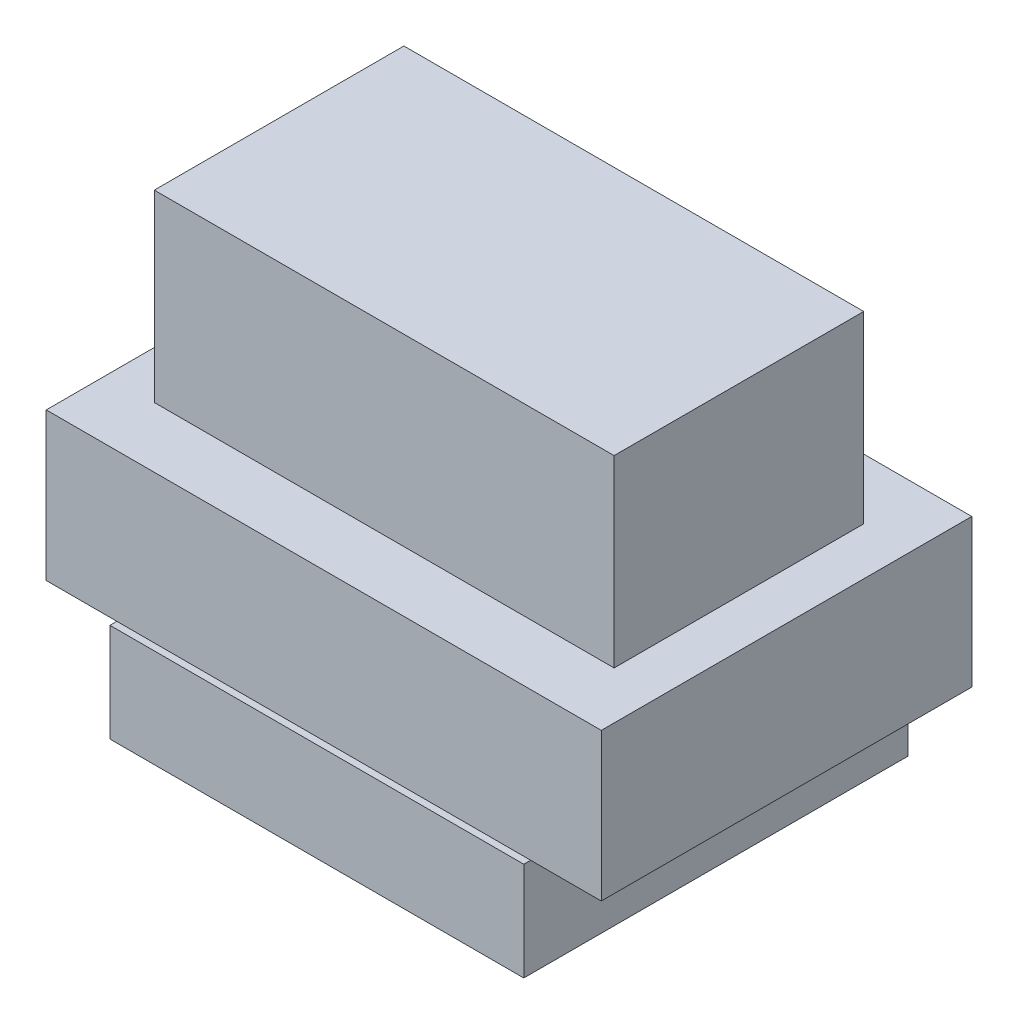
ISO-10303-21;
HEADER;
FILE_DESCRIPTION(('STEP AP214'),'2;1');
FILE_NAME('part.step','',(''),(''),'','','');
FILE_SCHEMA(('AUTOMOTIVE_DESIGN { 1 0 10303 214 1 1 1 1 }'));
ENDSEC;
DATA;
#1=APPLICATION_CONTEXT('core data for automotive mechanical design processes');
#2=APPLICATION_PROTOCOL_DEFINITION('international standard','automotive_design',2000,#1);
#3=PRODUCT_CONTEXT('',#1,'mechanical');
#4=PRODUCT('Part','Part','',(#3));
#5=PRODUCT_RELATED_PRODUCT_CATEGORY('part','',(#4));
#6=PRODUCT_DEFINITION_FORMATION('','',#4);
#7=PRODUCT_DEFINITION_CONTEXT('part definition',#1,'design');
#8=PRODUCT_DEFINITION('design','',#6,#7);
#9=PRODUCT_DEFINITION_SHAPE('','',#8);
#10=(LENGTH_UNIT() NAMED_UNIT(*) SI_UNIT(.MILLI.,.METRE.));
#11=(NAMED_UNIT(*) PLANE_ANGLE_UNIT() SI_UNIT($,.RADIAN.));
#12=(NAMED_UNIT(*) SI_UNIT($,.STERADIAN.) SOLID_ANGLE_UNIT());
#13=UNCERTAINTY_MEASURE_WITH_UNIT(LENGTH_MEASURE(1.E-05),#10,'distance_accuracy_value','');
#14=(GEOMETRIC_REPRESENTATION_CONTEXT(3) GLOBAL_UNCERTAINTY_ASSIGNED_CONTEXT((#13)) GLOBAL_UNIT_ASSIGNED_CONTEXT((#10,
#11,#12)) REPRESENTATION_CONTEXT('',''));
#15=CARTESIAN_POINT('',(0.,0.,0.));
#16=DIRECTION('',(0.,0.,1.));
#17=DIRECTION('',(1.,0.,0.));
#18=AXIS2_PLACEMENT_3D('',#15,#16,#17);
#19=CARTESIAN_POINT('',(0.,37.5,0.));
#20=DIRECTION('',(0.,-1.,0.));
#21=DIRECTION('',(0.,0.,-1.));
#22=AXIS2_PLACEMENT_3D('',#19,#20,#21);
#23=PLANE('',#22);
#24=DIRECTION('',(0.,0.,-1.));
#25=VECTOR('',#24,1.);
#26=CARTESIAN_POINT('',(42.25,37.5,28.2));
#27=LINE('',#26,#25);
#28=CARTESIAN_POINT('',(42.25,37.5,28.2));
#29=VERTEX_POINT('',#28);
#30=CARTESIAN_POINT('',(42.25,37.5,-28.2));
#31=VERTEX_POINT('',#30);
#32=EDGE_CURVE('E167',#29,#31,#27,.T.);
#33=ORIENTED_EDGE('',*,*,#32,.T.);
#34=DIRECTION('',(-1.,0.,0.));
#35=VECTOR('',#34,1.);
#36=CARTESIAN_POINT('',(-42.25,37.5,-28.2));
#37=LINE('',#36,#35);
#38=CARTESIAN_POINT('',(-42.25,37.5,-28.2));
#39=VERTEX_POINT('',#38);
#40=EDGE_CURVE('E170',#31,#39,#37,.T.);
#41=ORIENTED_EDGE('',*,*,#40,.T.);
#42=DIRECTION('',(0.,0.,1.));
#43=VECTOR('',#42,1.);
#44=CARTESIAN_POINT('',(-42.25,37.5,28.2));
#45=LINE('',#44,#43);
#46=CARTESIAN_POINT('',(-42.25,37.5,28.2));
#47=VERTEX_POINT('',#46);
#48=EDGE_CURVE('E172',#39,#47,#45,.T.);
#49=ORIENTED_EDGE('',*,*,#48,.T.);
#50=DIRECTION('',(1.,0.,0.));
#51=VECTOR('',#50,1.);
#52=CARTESIAN_POINT('',(-42.25,37.5,28.2));
#53=LINE('',#52,#51);
#54=EDGE_CURVE('E174',#47,#29,#53,.T.);
#55=ORIENTED_EDGE('',*,*,#54,.T.);
#56=EDGE_LOOP('',(#33,#41,#49,#55));
#57=FACE_BOUND('',#56,.T.);
#58=DIRECTION('',(0.,0.,-1.));
#59=VECTOR('',#58,1.);
#60=CARTESIAN_POINT('',(35.,37.5,19.));
#61=LINE('',#60,#59);
#62=CARTESIAN_POINT('',(35.,37.5,19.));
#63=VERTEX_POINT('',#62);
#64=CARTESIAN_POINT('',(35.,37.5,-19.));
#65=VERTEX_POINT('',#64);
#66=EDGE_CURVE('E157',#63,#65,#61,.T.);
#67=ORIENTED_EDGE('',*,*,#66,.F.);
#68=DIRECTION('',(1.,0.,0.));
#69=VECTOR('',#68,1.);
#70=CARTESIAN_POINT('',(-35.,37.5,19.));
#71=LINE('',#70,#69);
#72=CARTESIAN_POINT('',(-35.,37.5,19.));
#73=VERTEX_POINT('',#72);
#74=EDGE_CURVE('E154',#73,#63,#71,.T.);
#75=ORIENTED_EDGE('',*,*,#74,.F.);
#76=DIRECTION('',(0.,0.,1.));
#77=VECTOR('',#76,1.);
#78=CARTESIAN_POINT('',(-35.,37.5,19.));
#79=LINE('',#78,#77);
#80=CARTESIAN_POINT('',(-35.,37.5,-19.));
#81=VERTEX_POINT('',#80);
#82=EDGE_CURVE('E56',#81,#73,#79,.T.);
#83=ORIENTED_EDGE('',*,*,#82,.F.);
#84=DIRECTION('',(-1.,0.,0.));
#85=VECTOR('',#84,1.);
#86=CARTESIAN_POINT('',(-35.,37.5,-19.));
#87=LINE('',#86,#85);
#88=EDGE_CURVE('E51',#65,#81,#87,.T.);
#89=ORIENTED_EDGE('',*,*,#88,.F.);
#90=EDGE_LOOP('',(#67,#75,#83,#89));
#91=FACE_BOUND('',#90,.T.);
#92=ADVANCED_FACE('F32',(#57,#91),#23,.F.);
#93=CARTESIAN_POINT('',(0.,15.,0.));
#94=DIRECTION('',(0.,-1.,0.));
#95=DIRECTION('',(0.,0.,-1.));
#96=AXIS2_PLACEMENT_3D('',#93,#94,#95);
#97=PLANE('',#96);
#98=DIRECTION('',(1.,0.,0.));
#99=VECTOR('',#98,1.);
#100=CARTESIAN_POINT('',(-42.25,15.,28.2));
#101=LINE('',#100,#99);
#102=CARTESIAN_POINT('',(-31.5,15.,28.2));
#103=VERTEX_POINT('',#102);
#104=CARTESIAN_POINT('',(31.5,15.,28.2));
#105=VERTEX_POINT('',#104);
#106=EDGE_CURVE('E11',#103,#105,#101,.T.);
#107=ORIENTED_EDGE('',*,*,#106,.F.);
#108=DIRECTION('',(0.,0.,1.));
#109=VECTOR('',#108,1.);
#110=CARTESIAN_POINT('',(-31.5,15.,29.25));
#111=LINE('',#110,#109);
#112=CARTESIAN_POINT('',(-31.5,15.,29.25));
#113=VERTEX_POINT('',#112);
#114=EDGE_CURVE('E202',#103,#113,#111,.T.);
#115=ORIENTED_EDGE('',*,*,#114,.T.);
#116=DIRECTION('',(1.,0.,0.));
#117=VECTOR('',#116,1.);
#118=CARTESIAN_POINT('',(-31.5,15.,29.25));
#119=LINE('',#118,#117);
#120=CARTESIAN_POINT('',(31.5,15.,29.25));
#121=VERTEX_POINT('',#120);
#122=EDGE_CURVE('E205',#113,#121,#119,.T.);
#123=ORIENTED_EDGE('',*,*,#122,.T.);
#124=DIRECTION('',(0.,0.,-1.));
#125=VECTOR('',#124,1.);
#126=CARTESIAN_POINT('',(31.5,15.,29.25));
#127=LINE('',#126,#125);
#128=EDGE_CURVE('E195',#121,#105,#127,.T.);
#129=ORIENTED_EDGE('',*,*,#128,.T.);
#130=EDGE_LOOP('',(#107,#115,#123,#129));
#131=FACE_BOUND('',#130,.T.);
#132=ADVANCED_FACE('F278',(#131),#97,.F.);
#133=DIRECTION('',(-1.,0.,0.));
#134=VECTOR('',#133,1.);
#135=CARTESIAN_POINT('',(-42.25,15.,-28.2));
#136=LINE('',#135,#134);
#137=CARTESIAN_POINT('',(31.5,15.,-28.2));
#138=VERTEX_POINT('',#137);
#139=CARTESIAN_POINT('',(-31.5,15.,-28.2));
#140=VERTEX_POINT('',#139);
#141=EDGE_CURVE('E41',#138,#140,#136,.T.);
#142=ORIENTED_EDGE('',*,*,#141,.F.);
#143=CARTESIAN_POINT('',(31.5,15.,-29.25));
#144=VERTEX_POINT('',#143);
#145=EDGE_CURVE('E200',#138,#144,#127,.T.);
#146=ORIENTED_EDGE('',*,*,#145,.T.);
#147=DIRECTION('',(-1.,0.,0.));
#148=VECTOR('',#147,1.);
#149=CARTESIAN_POINT('',(-31.5,15.,-29.25));
#150=LINE('',#149,#148);
#151=CARTESIAN_POINT('',(-31.5,15.,-29.25));
#152=VERTEX_POINT('',#151);
#153=EDGE_CURVE('E198',#144,#152,#150,.T.);
#154=ORIENTED_EDGE('',*,*,#153,.T.);
#155=EDGE_CURVE('E203',#152,#140,#111,.T.);
#156=ORIENTED_EDGE('',*,*,#155,.T.);
#157=EDGE_LOOP('',(#142,#146,#154,#156));
#158=FACE_BOUND('',#157,.T.);
#159=ADVANCED_FACE('F264',(#158),#97,.F.);
#160=CARTESIAN_POINT('',(31.5,15.,29.25));
#161=DIRECTION('',(-1.,0.,0.));
#162=DIRECTION('',(0.,0.,1.));
#163=AXIS2_PLACEMENT_3D('',#160,#161,#162);
#164=PLANE('',#163);
#165=DIRECTION('',(0.,0.,-1.));
#166=VECTOR('',#165,1.);
#167=CARTESIAN_POINT('',(31.5,0.,29.25));
#168=LINE('',#167,#166);
#169=CARTESIAN_POINT('',(31.5,0.,29.25));
#170=VERTEX_POINT('',#169);
#171=CARTESIAN_POINT('',(31.5,0.,-29.25));
#172=VERTEX_POINT('',#171);
#173=EDGE_CURVE('E194',#170,#172,#168,.T.);
#174=ORIENTED_EDGE('',*,*,#173,.T.);
#175=DIRECTION('',(0.,-1.,0.));
#176=VECTOR('',#175,1.);
#177=CARTESIAN_POINT('',(31.5,15.,-29.25));
#178=LINE('',#177,#176);
#179=EDGE_CURVE('E36',#144,#172,#178,.T.);
#180=ORIENTED_EDGE('',*,*,#179,.F.);
#181=ORIENTED_EDGE('',*,*,#145,.F.);
#182=EDGE_CURVE('E199',#105,#138,#127,.T.);
#183=ORIENTED_EDGE('',*,*,#182,.F.);
#184=ORIENTED_EDGE('',*,*,#128,.F.);
#185=DIRECTION('',(0.,-1.,0.));
#186=VECTOR('',#185,1.);
#187=CARTESIAN_POINT('',(31.5,15.,29.25));
#188=LINE('',#187,#186);
#189=EDGE_CURVE('E208',#121,#170,#188,.T.);
#190=ORIENTED_EDGE('',*,*,#189,.T.);
#191=EDGE_LOOP('',(#174,#180,#181,#183,#184,#190));
#192=FACE_BOUND('',#191,.T.);
#193=ADVANCED_FACE('F34',(#192),#164,.F.);
#194=CARTESIAN_POINT('',(-31.5,15.,-29.25));
#195=DIRECTION('',(0.,0.,1.));
#196=DIRECTION('',(1.,0.,0.));
#197=AXIS2_PLACEMENT_3D('',#194,#195,#196);
#198=PLANE('',#197);
#199=DIRECTION('',(-1.,0.,0.));
#200=VECTOR('',#199,1.);
#201=CARTESIAN_POINT('',(-31.5,0.,-29.25));
#202=LINE('',#201,#200);
#203=CARTESIAN_POINT('',(-31.5,0.,-29.25));
#204=VERTEX_POINT('',#203);
#205=EDGE_CURVE('E211',#172,#204,#202,.T.);
#206=ORIENTED_EDGE('',*,*,#205,.T.);
#207=DIRECTION('',(0.,-1.,0.));
#208=VECTOR('',#207,1.);
#209=CARTESIAN_POINT('',(-31.5,15.,-29.25));
#210=LINE('',#209,#208);
#211=EDGE_CURVE('E221',#152,#204,#210,.T.);
#212=ORIENTED_EDGE('',*,*,#211,.F.);
#213=ORIENTED_EDGE('',*,*,#153,.F.);
#214=ORIENTED_EDGE('',*,*,#179,.T.);
#215=EDGE_LOOP('',(#206,#212,#213,#214));
#216=FACE_BOUND('',#215,.T.);
#217=ADVANCED_FACE('F265',(#216),#198,.F.);
#218=CARTESIAN_POINT('',(-31.5,15.,29.25));
#219=DIRECTION('',(1.,0.,0.));
#220=DIRECTION('',(0.,0.,-1.));
#221=AXIS2_PLACEMENT_3D('',#218,#219,#220);
#222=PLANE('',#221);
#223=DIRECTION('',(0.,0.,1.));
#224=VECTOR('',#223,1.);
#225=CARTESIAN_POINT('',(-31.5,0.,29.25));
#226=LINE('',#225,#224);
#227=CARTESIAN_POINT('',(-31.5,0.,29.25));
#228=VERTEX_POINT('',#227);
#229=EDGE_CURVE('E213',#204,#228,#226,.T.);
#230=ORIENTED_EDGE('',*,*,#229,.T.);
#231=DIRECTION('',(0.,-1.,0.));
#232=VECTOR('',#231,1.);
#233=CARTESIAN_POINT('',(-31.5,15.,29.25));
#234=LINE('',#233,#232);
#235=EDGE_CURVE('E219',#113,#228,#234,.T.);
#236=ORIENTED_EDGE('',*,*,#235,.F.);
#237=ORIENTED_EDGE('',*,*,#114,.F.);
#238=EDGE_CURVE('E206',#140,#103,#111,.T.);
#239=ORIENTED_EDGE('',*,*,#238,.F.);
#240=ORIENTED_EDGE('',*,*,#155,.F.);
#241=ORIENTED_EDGE('',*,*,#211,.T.);
#242=EDGE_LOOP('',(#230,#236,#237,#239,#240,#241));
#243=FACE_BOUND('',#242,.T.);
#244=ADVANCED_FACE('F272',(#243),#222,.F.);
#245=CARTESIAN_POINT('',(-31.5,15.,29.25));
#246=DIRECTION('',(0.,0.,-1.));
#247=DIRECTION('',(-1.,0.,0.));
#248=AXIS2_PLACEMENT_3D('',#245,#246,#247);
#249=PLANE('',#248);
#250=DIRECTION('',(1.,0.,0.));
#251=VECTOR('',#250,1.);
#252=CARTESIAN_POINT('',(-31.5,0.,29.25));
#253=LINE('',#252,#251);
#254=EDGE_CURVE('E215',#228,#170,#253,.T.);
#255=ORIENTED_EDGE('',*,*,#254,.T.);
#256=ORIENTED_EDGE('',*,*,#189,.F.);
#257=ORIENTED_EDGE('',*,*,#122,.F.);
#258=ORIENTED_EDGE('',*,*,#235,.T.);
#259=EDGE_LOOP('',(#255,#256,#257,#258));
#260=FACE_BOUND('',#259,.T.);
#261=ADVANCED_FACE('F276',(#260),#249,.F.);
#262=CARTESIAN_POINT('',(0.,0.,0.));
#263=DIRECTION('',(0.,-1.,0.));
#264=DIRECTION('',(0.,0.,-1.));
#265=AXIS2_PLACEMENT_3D('',#262,#263,#264);
#266=PLANE('',#265);
#267=ORIENTED_EDGE('',*,*,#173,.F.);
#268=ORIENTED_EDGE('',*,*,#254,.F.);
#269=ORIENTED_EDGE('',*,*,#229,.F.);
#270=ORIENTED_EDGE('',*,*,#205,.F.);
#271=EDGE_LOOP('',(#267,#268,#269,#270));
#272=FACE_BOUND('',#271,.T.);
#273=ADVANCED_FACE('F270',(#272),#266,.T.);
#274=CARTESIAN_POINT('',(0.,15.,0.));
#275=DIRECTION('',(0.,-1.,0.));
#276=DIRECTION('',(0.,0.,-1.));
#277=AXIS2_PLACEMENT_3D('',#274,#275,#276);
#278=PLANE('',#277);
#279=CARTESIAN_POINT('',(42.25,15.,28.2));
#280=VERTEX_POINT('',#279);
#281=EDGE_CURVE('E44',#105,#280,#101,.T.);
#282=ORIENTED_EDGE('',*,*,#281,.F.);
#283=ORIENTED_EDGE('',*,*,#182,.T.);
#284=CARTESIAN_POINT('',(42.25,15.,-28.2));
#285=VERTEX_POINT('',#284);
#286=EDGE_CURVE('E177',#285,#138,#136,.T.);
#287=ORIENTED_EDGE('',*,*,#286,.F.);
#288=DIRECTION('',(0.,0.,-1.));
#289=VECTOR('',#288,1.);
#290=CARTESIAN_POINT('',(42.25,15.,28.2));
#291=LINE('',#290,#289);
#292=EDGE_CURVE('E158',#280,#285,#291,.T.);
#293=ORIENTED_EDGE('',*,*,#292,.F.);
#294=EDGE_LOOP('',(#282,#283,#287,#293));
#295=FACE_BOUND('',#294,.T.);
#296=ADVANCED_FACE('F258',(#295),#278,.T.);
#297=CARTESIAN_POINT('',(42.25,37.5,28.2));
#298=DIRECTION('',(-1.,0.,0.));
#299=DIRECTION('',(0.,0.,1.));
#300=AXIS2_PLACEMENT_3D('',#297,#298,#299);
#301=PLANE('',#300);
#302=ORIENTED_EDGE('',*,*,#292,.T.);
#303=DIRECTION('',(0.,-1.,0.));
#304=VECTOR('',#303,1.);
#305=CARTESIAN_POINT('',(42.25,37.5,-28.2));
#306=LINE('',#305,#304);
#307=EDGE_CURVE('E191',#31,#285,#306,.T.);
#308=ORIENTED_EDGE('',*,*,#307,.F.);
#309=ORIENTED_EDGE('',*,*,#32,.F.);
#310=DIRECTION('',(0.,-1.,0.));
#311=VECTOR('',#310,1.);
#312=CARTESIAN_POINT('',(42.25,37.5,28.2));
#313=LINE('',#312,#311);
#314=EDGE_CURVE('E175',#29,#280,#313,.T.);
#315=ORIENTED_EDGE('',*,*,#314,.T.);
#316=EDGE_LOOP('',(#302,#308,#309,#315));
#317=FACE_BOUND('',#316,.T.);
#318=ADVANCED_FACE('F255',(#317),#301,.F.);
#319=CARTESIAN_POINT('',(-42.25,37.5,-28.2));
#320=DIRECTION('',(0.,0.,1.));
#321=DIRECTION('',(1.,0.,0.));
#322=AXIS2_PLACEMENT_3D('',#319,#320,#321);
#323=PLANE('',#322);
#324=ORIENTED_EDGE('',*,*,#286,.T.);
#325=ORIENTED_EDGE('',*,*,#141,.T.);
#326=CARTESIAN_POINT('',(-42.25,15.,-28.2));
#327=VERTEX_POINT('',#326);
#328=EDGE_CURVE('E161',#140,#327,#136,.T.);
#329=ORIENTED_EDGE('',*,*,#328,.T.);
#330=DIRECTION('',(0.,-1.,0.));
#331=VECTOR('',#330,1.);
#332=CARTESIAN_POINT('',(-42.25,37.5,-28.2));
#333=LINE('',#332,#331);
#334=EDGE_CURVE('E188',#39,#327,#333,.T.);
#335=ORIENTED_EDGE('',*,*,#334,.F.);
#336=ORIENTED_EDGE('',*,*,#40,.F.);
#337=ORIENTED_EDGE('',*,*,#307,.T.);
#338=EDGE_LOOP('',(#324,#325,#329,#335,#336,#337));
#339=FACE_BOUND('',#338,.T.);
#340=ADVANCED_FACE('F235',(#339),#323,.F.);
#341=CARTESIAN_POINT('',(-42.25,37.5,28.2));
#342=DIRECTION('',(1.,0.,0.));
#343=DIRECTION('',(0.,0.,-1.));
#344=AXIS2_PLACEMENT_3D('',#341,#342,#343);
#345=PLANE('',#344);
#346=DIRECTION('',(0.,0.,1.));
#347=VECTOR('',#346,1.);
#348=CARTESIAN_POINT('',(-42.25,15.,28.2));
#349=LINE('',#348,#347);
#350=CARTESIAN_POINT('',(-42.25,15.,28.2));
#351=VERTEX_POINT('',#350);
#352=EDGE_CURVE('E180',#327,#351,#349,.T.);
#353=ORIENTED_EDGE('',*,*,#352,.T.);
#354=DIRECTION('',(0.,-1.,0.));
#355=VECTOR('',#354,1.);
#356=CARTESIAN_POINT('',(-42.25,37.5,28.2));
#357=LINE('',#356,#355);
#358=EDGE_CURVE('E185',#47,#351,#357,.T.);
#359=ORIENTED_EDGE('',*,*,#358,.F.);
#360=ORIENTED_EDGE('',*,*,#48,.F.);
#361=ORIENTED_EDGE('',*,*,#334,.T.);
#362=EDGE_LOOP('',(#353,#359,#360,#361));
#363=FACE_BOUND('',#362,.T.);
#364=ADVANCED_FACE('F241',(#363),#345,.F.);
#365=CARTESIAN_POINT('',(-42.25,37.5,28.2));
#366=DIRECTION('',(0.,0.,-1.));
#367=DIRECTION('',(-1.,0.,0.));
#368=AXIS2_PLACEMENT_3D('',#365,#366,#367);
#369=PLANE('',#368);
#370=EDGE_CURVE('E43',#351,#103,#101,.T.);
#371=ORIENTED_EDGE('',*,*,#370,.T.);
#372=ORIENTED_EDGE('',*,*,#106,.T.);
#373=ORIENTED_EDGE('',*,*,#281,.T.);
#374=ORIENTED_EDGE('',*,*,#314,.F.);
#375=ORIENTED_EDGE('',*,*,#54,.F.);
#376=ORIENTED_EDGE('',*,*,#358,.T.);
#377=EDGE_LOOP('',(#371,#372,#373,#374,#375,#376));
#378=FACE_BOUND('',#377,.T.);
#379=ADVANCED_FACE('F247',(#378),#369,.F.);
#380=ORIENTED_EDGE('',*,*,#328,.F.);
#381=ORIENTED_EDGE('',*,*,#238,.T.);
#382=ORIENTED_EDGE('',*,*,#370,.F.);
#383=ORIENTED_EDGE('',*,*,#352,.F.);
#384=EDGE_LOOP('',(#380,#381,#382,#383));
#385=FACE_BOUND('',#384,.T.);
#386=ADVANCED_FACE('F244',(#385),#278,.T.);
#387=CARTESIAN_POINT('',(35.,65.5,19.));
#388=DIRECTION('',(-1.,0.,0.));
#389=DIRECTION('',(0.,0.,1.));
#390=AXIS2_PLACEMENT_3D('',#387,#388,#389);
#391=PLANE('',#390);
#392=ORIENTED_EDGE('',*,*,#66,.T.);
#393=DIRECTION('',(0.,-1.,0.));
#394=VECTOR('',#393,1.);
#395=CARTESIAN_POINT('',(35.,65.5,-19.));
#396=LINE('',#395,#394);
#397=CARTESIAN_POINT('',(35.,65.5,-19.));
#398=VERTEX_POINT('',#397);
#399=EDGE_CURVE('E138',#398,#65,#396,.T.);
#400=ORIENTED_EDGE('',*,*,#399,.F.);
#401=DIRECTION('',(0.,0.,-1.));
#402=VECTOR('',#401,1.);
#403=CARTESIAN_POINT('',(35.,65.5,19.));
#404=LINE('',#403,#402);
#405=CARTESIAN_POINT('',(35.,65.5,19.));
#406=VERTEX_POINT('',#405);
#407=EDGE_CURVE('E145',#406,#398,#404,.T.);
#408=ORIENTED_EDGE('',*,*,#407,.F.);
#409=DIRECTION('',(0.,-1.,0.));
#410=VECTOR('',#409,1.);
#411=CARTESIAN_POINT('',(35.,65.5,19.));
#412=LINE('',#411,#410);
#413=EDGE_CURVE('E433',#406,#63,#412,.T.);
#414=ORIENTED_EDGE('',*,*,#413,.T.);
#415=EDGE_LOOP('',(#392,#400,#408,#414));
#416=FACE_BOUND('',#415,.T.);
#417=ADVANCED_FACE('F156',(#416),#391,.F.);
#418=CARTESIAN_POINT('',(-35.,65.5,-19.));
#419=DIRECTION('',(0.,0.,1.));
#420=DIRECTION('',(1.,0.,0.));
#421=AXIS2_PLACEMENT_3D('',#418,#419,#420);
#422=PLANE('',#421);
#423=ORIENTED_EDGE('',*,*,#88,.T.);
#424=DIRECTION('',(0.,-1.,0.));
#425=VECTOR('',#424,1.);
#426=CARTESIAN_POINT('',(-35.,65.5,-19.));
#427=LINE('',#426,#425);
#428=CARTESIAN_POINT('',(-35.,65.5,-19.));
#429=VERTEX_POINT('',#428);
#430=EDGE_CURVE('E141',#429,#81,#427,.T.);
#431=ORIENTED_EDGE('',*,*,#430,.F.);
#432=DIRECTION('',(-1.,0.,0.));
#433=VECTOR('',#432,1.);
#434=CARTESIAN_POINT('',(-35.,65.5,-19.));
#435=LINE('',#434,#433);
#436=EDGE_CURVE('E134',#398,#429,#435,.T.);
#437=ORIENTED_EDGE('',*,*,#436,.F.);
#438=ORIENTED_EDGE('',*,*,#399,.T.);
#439=EDGE_LOOP('',(#423,#431,#437,#438));
#440=FACE_BOUND('',#439,.T.);
#441=ADVANCED_FACE('F136',(#440),#422,.F.);
#442=CARTESIAN_POINT('',(-35.,65.5,19.));
#443=DIRECTION('',(1.,0.,0.));
#444=DIRECTION('',(0.,0.,-1.));
#445=AXIS2_PLACEMENT_3D('',#442,#443,#444);
#446=PLANE('',#445);
#447=ORIENTED_EDGE('',*,*,#82,.T.);
#448=DIRECTION('',(0.,-1.,0.));
#449=VECTOR('',#448,1.);
#450=CARTESIAN_POINT('',(-35.,65.5,19.));
#451=LINE('',#450,#449);
#452=CARTESIAN_POINT('',(-35.,65.5,19.));
#453=VERTEX_POINT('',#452);
#454=EDGE_CURVE('E163',#453,#73,#451,.T.);
#455=ORIENTED_EDGE('',*,*,#454,.F.);
#456=DIRECTION('',(0.,0.,1.));
#457=VECTOR('',#456,1.);
#458=CARTESIAN_POINT('',(-35.,65.5,19.));
#459=LINE('',#458,#457);
#460=EDGE_CURVE('E144',#429,#453,#459,.T.);
#461=ORIENTED_EDGE('',*,*,#460,.F.);
#462=ORIENTED_EDGE('',*,*,#430,.T.);
#463=EDGE_LOOP('',(#447,#455,#461,#462));
#464=FACE_BOUND('',#463,.T.);
#465=ADVANCED_FACE('F400',(#464),#446,.F.);
#466=CARTESIAN_POINT('',(-35.,65.5,19.));
#467=DIRECTION('',(0.,0.,-1.));
#468=DIRECTION('',(-1.,0.,0.));
#469=AXIS2_PLACEMENT_3D('',#466,#467,#468);
#470=PLANE('',#469);
#471=ORIENTED_EDGE('',*,*,#74,.T.);
#472=ORIENTED_EDGE('',*,*,#413,.F.);
#473=DIRECTION('',(1.,0.,0.));
#474=VECTOR('',#473,1.);
#475=CARTESIAN_POINT('',(-35.,65.5,19.));
#476=LINE('',#475,#474);
#477=EDGE_CURVE('E150',#453,#406,#476,.T.);
#478=ORIENTED_EDGE('',*,*,#477,.F.);
#479=ORIENTED_EDGE('',*,*,#454,.T.);
#480=EDGE_LOOP('',(#471,#472,#478,#479));
#481=FACE_BOUND('',#480,.T.);
#482=ADVANCED_FACE('F409',(#481),#470,.F.);
#483=CARTESIAN_POINT('',(0.,65.5,0.));
#484=DIRECTION('',(0.,-1.,0.));
#485=DIRECTION('',(0.,0.,-1.));
#486=AXIS2_PLACEMENT_3D('',#483,#484,#485);
#487=PLANE('',#486);
#488=ORIENTED_EDGE('',*,*,#407,.T.);
#489=ORIENTED_EDGE('',*,*,#436,.T.);
#490=ORIENTED_EDGE('',*,*,#460,.T.);
#491=ORIENTED_EDGE('',*,*,#477,.T.);
#492=EDGE_LOOP('',(#488,#489,#490,#491));
#493=FACE_BOUND('',#492,.T.);
#494=ADVANCED_FACE('F148',(#493),#487,.F.);
#495=CLOSED_SHELL('',(#92,#132,#159,#193,#217,#244,#261,#273,#296,#318,#340,#364,#379,#386,#417,
#441,#465,#482,#494));
#496=MANIFOLD_SOLID_BREP('B2',#495);
#497=ADVANCED_BREP_SHAPE_REPRESENTATION('',(#18,#496),#14);
#498=SHAPE_DEFINITION_REPRESENTATION(#9,#497);
ENDSEC;
END-ISO-10303-21;
